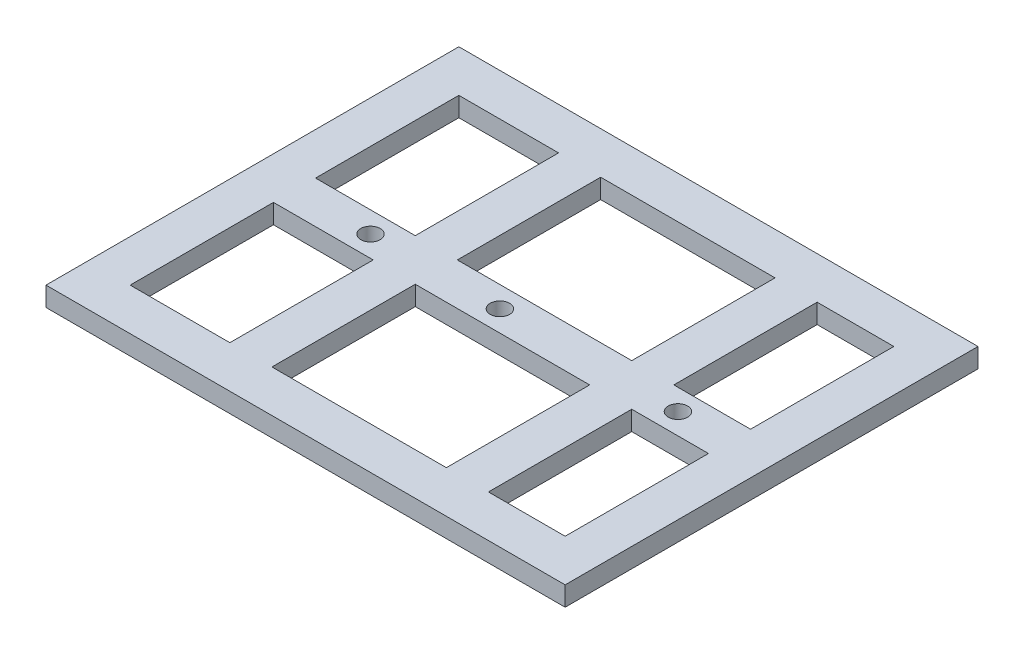
ISO-10303-21;
HEADER;
FILE_DESCRIPTION(('STEP AP214'),'2;1');
FILE_NAME('part.step','',(''),(''),'','','');
FILE_SCHEMA(('AUTOMOTIVE_DESIGN { 1 0 10303 214 1 1 1 1 }'));
ENDSEC;
DATA;
#1=APPLICATION_CONTEXT('core data for automotive mechanical design processes');
#2=APPLICATION_PROTOCOL_DEFINITION('international standard','automotive_design',2000,#1);
#3=PRODUCT_CONTEXT('',#1,'mechanical');
#4=PRODUCT('Part','Part','',(#3));
#5=PRODUCT_RELATED_PRODUCT_CATEGORY('part','',(#4));
#6=PRODUCT_DEFINITION_FORMATION('','',#4);
#7=PRODUCT_DEFINITION_CONTEXT('part definition',#1,'design');
#8=PRODUCT_DEFINITION('design','',#6,#7);
#9=PRODUCT_DEFINITION_SHAPE('','',#8);
#10=(LENGTH_UNIT() NAMED_UNIT(*) SI_UNIT(.MILLI.,.METRE.));
#11=(NAMED_UNIT(*) PLANE_ANGLE_UNIT() SI_UNIT($,.RADIAN.));
#12=(NAMED_UNIT(*) SI_UNIT($,.STERADIAN.) SOLID_ANGLE_UNIT());
#13=UNCERTAINTY_MEASURE_WITH_UNIT(LENGTH_MEASURE(1.E-05),#10,'distance_accuracy_value','');
#14=(GEOMETRIC_REPRESENTATION_CONTEXT(3) GLOBAL_UNCERTAINTY_ASSIGNED_CONTEXT((#13)) GLOBAL_UNIT_ASSIGNED_CONTEXT((#10,
#11,#12)) REPRESENTATION_CONTEXT('',''));
#15=CARTESIAN_POINT('',(0.,0.,0.));
#16=DIRECTION('',(0.,0.,1.));
#17=DIRECTION('',(1.,0.,0.));
#18=AXIS2_PLACEMENT_3D('',#15,#16,#17);
#19=CARTESIAN_POINT('',(0.,1.5,0.));
#20=DIRECTION('',(0.,1.,0.));
#21=DIRECTION('',(0.,0.,1.));
#22=AXIS2_PLACEMENT_3D('',#19,#20,#21);
#23=PLANE('',#22);
#24=CARTESIAN_POINT('',(-1.86403506424479,1.5,0.));
#25=DIRECTION('',(0.,1.,0.));
#26=DIRECTION('',(0.,0.,1.));
#27=AXIS2_PLACEMENT_3D('',#24,#25,#26);
#28=CIRCLE('',#27,1.5);
#29=CARTESIAN_POINT('',(-1.86403506424479,1.5,1.5));
#30=VERTEX_POINT('',#29);
#31=EDGE_CURVE('E614',#30,#30,#28,.T.);
#32=ORIENTED_EDGE('',*,*,#31,.F.);
#33=EDGE_LOOP('',(#32));
#34=FACE_BOUND('',#33,.T.);
#35=DIRECTION('',(0.,0.,-1.));
#36=VECTOR('',#35,1.);
#37=CARTESIAN_POINT('',(15.2481948309043,1.5,3.25));
#38=LINE('',#37,#36);
#39=CARTESIAN_POINT('',(15.2481948309043,1.5,25.3904986670103));
#40=VERTEX_POINT('',#39);
#41=CARTESIAN_POINT('',(15.2481948309043,1.5,3.25));
#42=VERTEX_POINT('',#41);
#43=EDGE_CURVE('E232',#40,#42,#38,.T.);
#44=ORIENTED_EDGE('',*,*,#43,.F.);
#45=DIRECTION('',(1.,0.,0.));
#46=VECTOR('',#45,1.);
#47=CARTESIAN_POINT('',(-11.6956151921089,1.5,25.3904986670103));
#48=LINE('',#47,#46);
#49=CARTESIAN_POINT('',(-11.6956151921089,1.5,25.3904986670103));
#50=VERTEX_POINT('',#49);
#51=EDGE_CURVE('E224',#50,#40,#48,.T.);
#52=ORIENTED_EDGE('',*,*,#51,.F.);
#53=DIRECTION('',(0.,0.,1.));
#54=VECTOR('',#53,1.);
#55=CARTESIAN_POINT('',(-11.6956151921089,1.5,3.25));
#56=LINE('',#55,#54);
#57=CARTESIAN_POINT('',(-11.6956151921089,1.5,3.25));
#58=VERTEX_POINT('',#57);
#59=EDGE_CURVE('E247',#58,#50,#56,.T.);
#60=ORIENTED_EDGE('',*,*,#59,.F.);
#61=DIRECTION('',(-1.,0.,0.));
#62=VECTOR('',#61,1.);
#63=CARTESIAN_POINT('',(-11.6956151921089,1.5,3.25));
#64=LINE('',#63,#62);
#65=EDGE_CURVE('E245',#42,#58,#64,.T.);
#66=ORIENTED_EDGE('',*,*,#65,.F.);
#67=EDGE_LOOP('',(#44,#52,#60,#66));
#68=FACE_BOUND('',#67,.T.);
#69=DIRECTION('',(0.,0.,1.));
#70=VECTOR('',#69,1.);
#71=CARTESIAN_POINT('',(-11.6956151921089,1.5,-25.3904986670103));
#72=LINE('',#71,#70);
#73=CARTESIAN_POINT('',(-11.6956151921089,1.5,-25.3904986670103));
#74=VERTEX_POINT('',#73);
#75=CARTESIAN_POINT('',(-11.6956151921089,1.5,-3.24999999999999));
#76=VERTEX_POINT('',#75);
#77=EDGE_CURVE('E265',#74,#76,#72,.T.);
#78=ORIENTED_EDGE('',*,*,#77,.F.);
#79=DIRECTION('',(-1.,0.,0.));
#80=VECTOR('',#79,1.);
#81=CARTESIAN_POINT('',(-11.6956151921089,1.5,-25.3904986670103));
#82=LINE('',#81,#80);
#83=CARTESIAN_POINT('',(15.2481948309043,1.5,-25.3904986670103));
#84=VERTEX_POINT('',#83);
#85=EDGE_CURVE('E263',#84,#74,#82,.T.);
#86=ORIENTED_EDGE('',*,*,#85,.F.);
#87=DIRECTION('',(0.,0.,-1.));
#88=VECTOR('',#87,1.);
#89=CARTESIAN_POINT('',(15.2481948309043,1.5,-25.3904986670103));
#90=LINE('',#89,#88);
#91=CARTESIAN_POINT('',(15.2481948309043,1.5,-3.24999999999999));
#92=VERTEX_POINT('',#91);
#93=EDGE_CURVE('E271',#92,#84,#90,.T.);
#94=ORIENTED_EDGE('',*,*,#93,.F.);
#95=DIRECTION('',(1.,0.,0.));
#96=VECTOR('',#95,1.);
#97=CARTESIAN_POINT('',(-11.6956151921089,1.5,-3.24999999999999));
#98=LINE('',#97,#96);
#99=EDGE_CURVE('E268',#76,#92,#98,.T.);
#100=ORIENTED_EDGE('',*,*,#99,.F.);
#101=EDGE_LOOP('',(#78,#86,#94,#100));
#102=FACE_BOUND('',#101,.T.);
#103=DIRECTION('',(0.,0.,-1.));
#104=VECTOR('',#103,1.);
#105=CARTESIAN_POINT('',(33.6012807303815,1.5,25.3904986670103));
#106=LINE('',#105,#104);
#107=CARTESIAN_POINT('',(33.6012807303815,1.5,25.3904986670103));
#108=VERTEX_POINT('',#107);
#109=CARTESIAN_POINT('',(33.6012807303815,1.5,3.24999999999999));
#110=VERTEX_POINT('',#109);
#111=EDGE_CURVE('E296',#108,#110,#106,.T.);
#112=ORIENTED_EDGE('',*,*,#111,.F.);
#113=DIRECTION('',(1.,0.,0.));
#114=VECTOR('',#113,1.);
#115=CARTESIAN_POINT('',(21.7481948309043,1.5,25.3904986670103));
#116=LINE('',#115,#114);
#117=CARTESIAN_POINT('',(21.7481948309043,1.5,25.3904986670103));
#118=VERTEX_POINT('',#117);
#119=EDGE_CURVE('E294',#118,#108,#116,.T.);
#120=ORIENTED_EDGE('',*,*,#119,.F.);
#121=DIRECTION('',(0.,0.,1.));
#122=VECTOR('',#121,1.);
#123=CARTESIAN_POINT('',(21.7481948309043,1.5,3.24999999999999));
#124=LINE('',#123,#122);
#125=CARTESIAN_POINT('',(21.7481948309043,1.5,3.24999999999999));
#126=VERTEX_POINT('',#125);
#127=EDGE_CURVE('E302',#126,#118,#124,.T.);
#128=ORIENTED_EDGE('',*,*,#127,.F.);
#129=DIRECTION('',(-1.,0.,0.));
#130=VECTOR('',#129,1.);
#131=CARTESIAN_POINT('',(21.7481948309043,1.5,3.24999999999999));
#132=LINE('',#131,#130);
#133=EDGE_CURVE('E299',#110,#126,#132,.T.);
#134=ORIENTED_EDGE('',*,*,#133,.F.);
#135=EDGE_LOOP('',(#112,#120,#128,#134));
#136=FACE_BOUND('',#135,.T.);
#137=DIRECTION('',(1.,0.,0.));
#138=VECTOR('',#137,1.);
#139=CARTESIAN_POINT('',(-33.6012807303815,1.5,-3.24999999999999));
#140=LINE('',#139,#138);
#141=CARTESIAN_POINT('',(-33.6012807303815,1.5,-3.24999999999999));
#142=VERTEX_POINT('',#141);
#143=CARTESIAN_POINT('',(-18.1956151921089,1.5,-3.24999999999999));
#144=VERTEX_POINT('',#143);
#145=EDGE_CURVE('E327',#142,#144,#140,.T.);
#146=ORIENTED_EDGE('',*,*,#145,.F.);
#147=DIRECTION('',(0.,0.,1.));
#148=VECTOR('',#147,1.);
#149=CARTESIAN_POINT('',(-33.6012807303815,1.5,-3.24999999999999));
#150=LINE('',#149,#148);
#151=CARTESIAN_POINT('',(-33.6012807303815,1.5,-25.3904986670103));
#152=VERTEX_POINT('',#151);
#153=EDGE_CURVE('E325',#152,#142,#150,.T.);
#154=ORIENTED_EDGE('',*,*,#153,.F.);
#155=DIRECTION('',(-1.,0.,0.));
#156=VECTOR('',#155,1.);
#157=CARTESIAN_POINT('',(-33.6012807303815,1.5,-25.3904986670103));
#158=LINE('',#157,#156);
#159=CARTESIAN_POINT('',(-18.1956151921089,1.5,-25.3904986670103));
#160=VERTEX_POINT('',#159);
#161=EDGE_CURVE('E333',#160,#152,#158,.T.);
#162=ORIENTED_EDGE('',*,*,#161,.F.);
#163=DIRECTION('',(0.,0.,-1.));
#164=VECTOR('',#163,1.);
#165=CARTESIAN_POINT('',(-18.1956151921089,1.5,-25.3904986670103));
#166=LINE('',#165,#164);
#167=EDGE_CURVE('E330',#144,#160,#166,.T.);
#168=ORIENTED_EDGE('',*,*,#167,.F.);
#169=EDGE_LOOP('',(#146,#154,#162,#168));
#170=FACE_BOUND('',#169,.T.);
#171=DIRECTION('',(1.,0.,0.));
#172=VECTOR('',#171,1.);
#173=CARTESIAN_POINT('',(-33.6012807303815,1.5,25.3904986670103));
#174=LINE('',#173,#172);
#175=CARTESIAN_POINT('',(-33.6012807303815,1.5,25.3904986670103));
#176=VERTEX_POINT('',#175);
#177=CARTESIAN_POINT('',(-18.1956151921089,1.5,25.3904986670103));
#178=VERTEX_POINT('',#177);
#179=EDGE_CURVE('E358',#176,#178,#174,.T.);
#180=ORIENTED_EDGE('',*,*,#179,.F.);
#181=DIRECTION('',(0.,0.,1.));
#182=VECTOR('',#181,1.);
#183=CARTESIAN_POINT('',(-33.6012807303815,1.5,25.3904986670103));
#184=LINE('',#183,#182);
#185=CARTESIAN_POINT('',(-33.6012807303815,1.5,3.25000000000001));
#186=VERTEX_POINT('',#185);
#187=EDGE_CURVE('E356',#186,#176,#184,.T.);
#188=ORIENTED_EDGE('',*,*,#187,.F.);
#189=DIRECTION('',(-1.,0.,0.));
#190=VECTOR('',#189,1.);
#191=CARTESIAN_POINT('',(-33.6012807303815,1.5,3.25000000000001));
#192=LINE('',#191,#190);
#193=CARTESIAN_POINT('',(-18.1956151921089,1.5,3.25));
#194=VERTEX_POINT('',#193);
#195=EDGE_CURVE('E364',#194,#186,#192,.T.);
#196=ORIENTED_EDGE('',*,*,#195,.F.);
#197=DIRECTION('',(0.,0.,-1.));
#198=VECTOR('',#197,1.);
#199=CARTESIAN_POINT('',(-18.1956151921089,1.5,3.25));
#200=LINE('',#199,#198);
#201=EDGE_CURVE('E361',#178,#194,#200,.T.);
#202=ORIENTED_EDGE('',*,*,#201,.F.);
#203=EDGE_LOOP('',(#180,#188,#196,#202));
#204=FACE_BOUND('',#203,.T.);
#205=DIRECTION('',(-1.,0.,0.));
#206=VECTOR('',#205,1.);
#207=CARTESIAN_POINT('',(21.7481948309042,1.5,-25.3904986670103));
#208=LINE('',#207,#206);
#209=CARTESIAN_POINT('',(33.6012807303815,1.5,-25.3904986670103));
#210=VERTEX_POINT('',#209);
#211=CARTESIAN_POINT('',(21.7481948309042,1.5,-25.3904986670103));
#212=VERTEX_POINT('',#211);
#213=EDGE_CURVE('E389',#210,#212,#208,.T.);
#214=ORIENTED_EDGE('',*,*,#213,.F.);
#215=DIRECTION('',(0.,0.,-1.));
#216=VECTOR('',#215,1.);
#217=CARTESIAN_POINT('',(33.6012807303815,1.5,-3.24999999999999));
#218=LINE('',#217,#216);
#219=CARTESIAN_POINT('',(33.6012807303815,1.5,-3.24999999999999));
#220=VERTEX_POINT('',#219);
#221=EDGE_CURVE('E387',#220,#210,#218,.T.);
#222=ORIENTED_EDGE('',*,*,#221,.F.);
#223=DIRECTION('',(1.,0.,0.));
#224=VECTOR('',#223,1.);
#225=CARTESIAN_POINT('',(21.7481948309043,1.5,-3.24999999999999));
#226=LINE('',#225,#224);
#227=CARTESIAN_POINT('',(21.7481948309043,1.5,-3.24999999999999));
#228=VERTEX_POINT('',#227);
#229=EDGE_CURVE('E395',#228,#220,#226,.T.);
#230=ORIENTED_EDGE('',*,*,#229,.F.);
#231=DIRECTION('',(0.,0.,1.));
#232=VECTOR('',#231,1.);
#233=CARTESIAN_POINT('',(21.7481948309042,1.5,-25.3904986670103));
#234=LINE('',#233,#232);
#235=EDGE_CURVE('E392',#212,#228,#234,.T.);
#236=ORIENTED_EDGE('',*,*,#235,.F.);
#237=EDGE_LOOP('',(#214,#222,#230,#236));
#238=FACE_BOUND('',#237,.T.);
#239=DIRECTION('',(1.,0.,0.));
#240=VECTOR('',#239,1.);
#241=CARTESIAN_POINT('',(-40.1012807303815,1.5,31.8904986670103));
#242=LINE('',#241,#240);
#243=CARTESIAN_POINT('',(-40.1012807303815,1.5,31.8904986670103));
#244=VERTEX_POINT('',#243);
#245=CARTESIAN_POINT('',(40.1012807303815,1.5,31.8904986670103));
#246=VERTEX_POINT('',#245);
#247=EDGE_CURVE('E418',#244,#246,#242,.T.);
#248=ORIENTED_EDGE('',*,*,#247,.T.);
#249=DIRECTION('',(0.,0.,-1.));
#250=VECTOR('',#249,1.);
#251=CARTESIAN_POINT('',(40.1012807303815,1.5,31.8904986670103));
#252=LINE('',#251,#250);
#253=CARTESIAN_POINT('',(40.1012807303815,1.5,-31.8904986670103));
#254=VERTEX_POINT('',#253);
#255=EDGE_CURVE('E421',#246,#254,#252,.T.);
#256=ORIENTED_EDGE('',*,*,#255,.T.);
#257=DIRECTION('',(-1.,0.,0.));
#258=VECTOR('',#257,1.);
#259=CARTESIAN_POINT('',(-40.1012807303815,1.5,-31.8904986670103));
#260=LINE('',#259,#258);
#261=CARTESIAN_POINT('',(-40.1012807303815,1.5,-31.8904986670103));
#262=VERTEX_POINT('',#261);
#263=EDGE_CURVE('E424',#254,#262,#260,.T.);
#264=ORIENTED_EDGE('',*,*,#263,.T.);
#265=DIRECTION('',(0.,0.,1.));
#266=VECTOR('',#265,1.);
#267=CARTESIAN_POINT('',(-40.1012807303815,1.5,31.8904986670103));
#268=LINE('',#267,#266);
#269=EDGE_CURVE('E426',#262,#244,#268,.T.);
#270=ORIENTED_EDGE('',*,*,#269,.T.);
#271=EDGE_LOOP('',(#248,#256,#264,#270));
#272=FACE_BOUND('',#271,.T.);
#273=CARTESIAN_POINT('',(-21.8640350642448,1.5,0.));
#274=DIRECTION('',(0.,1.,0.));
#275=DIRECTION('',(0.,0.,1.));
#276=AXIS2_PLACEMENT_3D('',#273,#274,#275);
#277=CIRCLE('',#276,1.5);
#278=CARTESIAN_POINT('',(-21.8640350642448,1.5,1.50000000000001));
#279=VERTEX_POINT('',#278);
#280=EDGE_CURVE('E253',#279,#279,#277,.T.);
#281=ORIENTED_EDGE('',*,*,#280,.F.);
#282=EDGE_LOOP('',(#281));
#283=FACE_BOUND('',#282,.T.);
#284=CARTESIAN_POINT('',(25.6359649357552,1.5,0.));
#285=DIRECTION('',(0.,1.,0.));
#286=DIRECTION('',(0.,0.,1.));
#287=AXIS2_PLACEMENT_3D('',#284,#285,#286);
#288=CIRCLE('',#287,1.5);
#289=CARTESIAN_POINT('',(25.6359649357552,1.5,1.50000000000001));
#290=VERTEX_POINT('',#289);
#291=EDGE_CURVE('E605',#290,#290,#288,.T.);
#292=ORIENTED_EDGE('',*,*,#291,.F.);
#293=EDGE_LOOP('',(#292));
#294=FACE_BOUND('',#293,.T.);
#295=ADVANCED_FACE('F39',(#34,#68,#102,#136,#170,#204,#238,#272,#283,#294),#23,.T.);
#296=CARTESIAN_POINT('',(0.,-1.5,0.));
#297=DIRECTION('',(0.,1.,0.));
#298=DIRECTION('',(0.,0.,1.));
#299=AXIS2_PLACEMENT_3D('',#296,#297,#298);
#300=PLANE('',#299);
#301=DIRECTION('',(-1.,0.,0.));
#302=VECTOR('',#301,1.);
#303=CARTESIAN_POINT('',(-11.6956151921089,-1.5,-25.3904986670103));
#304=LINE('',#303,#302);
#305=CARTESIAN_POINT('',(15.2481948309043,-1.5,-25.3904986670103));
#306=VERTEX_POINT('',#305);
#307=CARTESIAN_POINT('',(-11.6956151921089,-1.5,-25.3904986670103));
#308=VERTEX_POINT('',#307);
#309=EDGE_CURVE('E240',#306,#308,#304,.T.);
#310=ORIENTED_EDGE('',*,*,#309,.T.);
#311=DIRECTION('',(0.,0.,1.));
#312=VECTOR('',#311,1.);
#313=CARTESIAN_POINT('',(-11.6956151921089,-1.5,-25.3904986670103));
#314=LINE('',#313,#312);
#315=CARTESIAN_POINT('',(-11.6956151921089,-1.5,-3.24999999999999));
#316=VERTEX_POINT('',#315);
#317=EDGE_CURVE('E276',#308,#316,#314,.T.);
#318=ORIENTED_EDGE('',*,*,#317,.T.);
#319=DIRECTION('',(1.,0.,0.));
#320=VECTOR('',#319,1.);
#321=CARTESIAN_POINT('',(-11.6956151921089,-1.5,-3.24999999999999));
#322=LINE('',#321,#320);
#323=CARTESIAN_POINT('',(15.2481948309043,-1.5,-3.24999999999999));
#324=VERTEX_POINT('',#323);
#325=EDGE_CURVE('E279',#316,#324,#322,.T.);
#326=ORIENTED_EDGE('',*,*,#325,.T.);
#327=DIRECTION('',(0.,0.,-1.));
#328=VECTOR('',#327,1.);
#329=CARTESIAN_POINT('',(15.2481948309043,-1.5,-25.3904986670103));
#330=LINE('',#329,#328);
#331=EDGE_CURVE('E266',#324,#306,#330,.T.);
#332=ORIENTED_EDGE('',*,*,#331,.T.);
#333=EDGE_LOOP('',(#310,#318,#326,#332));
#334=FACE_BOUND('',#333,.T.);
#335=DIRECTION('',(0.,0.,1.));
#336=VECTOR('',#335,1.);
#337=CARTESIAN_POINT('',(-33.6012807303815,-1.5,-3.24999999999999));
#338=LINE('',#337,#336);
#339=CARTESIAN_POINT('',(-33.6012807303815,-1.5,-25.3904986670103));
#340=VERTEX_POINT('',#339);
#341=CARTESIAN_POINT('',(-33.6012807303815,-1.5,-3.24999999999999));
#342=VERTEX_POINT('',#341);
#343=EDGE_CURVE('E324',#340,#342,#338,.T.);
#344=ORIENTED_EDGE('',*,*,#343,.T.);
#345=DIRECTION('',(1.,0.,0.));
#346=VECTOR('',#345,1.);
#347=CARTESIAN_POINT('',(-33.6012807303815,-1.5,-3.24999999999999));
#348=LINE('',#347,#346);
#349=CARTESIAN_POINT('',(-18.1956151921089,-1.5,-3.24999999999999));
#350=VERTEX_POINT('',#349);
#351=EDGE_CURVE('E338',#342,#350,#348,.T.);
#352=ORIENTED_EDGE('',*,*,#351,.T.);
#353=DIRECTION('',(0.,0.,-1.));
#354=VECTOR('',#353,1.);
#355=CARTESIAN_POINT('',(-18.1956151921089,-1.5,-25.3904986670103));
#356=LINE('',#355,#354);
#357=CARTESIAN_POINT('',(-18.1956151921089,-1.5,-25.3904986670103));
#358=VERTEX_POINT('',#357);
#359=EDGE_CURVE('E341',#350,#358,#356,.T.);
#360=ORIENTED_EDGE('',*,*,#359,.T.);
#361=DIRECTION('',(-1.,0.,0.));
#362=VECTOR('',#361,1.);
#363=CARTESIAN_POINT('',(-33.6012807303815,-1.5,-25.3904986670103));
#364=LINE('',#363,#362);
#365=EDGE_CURVE('E328',#358,#340,#364,.T.);
#366=ORIENTED_EDGE('',*,*,#365,.T.);
#367=EDGE_LOOP('',(#344,#352,#360,#366));
#368=FACE_BOUND('',#367,.T.);
#369=DIRECTION('',(0.,0.,-1.));
#370=VECTOR('',#369,1.);
#371=CARTESIAN_POINT('',(33.6012807303815,-1.5,-3.24999999999999));
#372=LINE('',#371,#370);
#373=CARTESIAN_POINT('',(33.6012807303815,-1.5,-3.24999999999999));
#374=VERTEX_POINT('',#373);
#375=CARTESIAN_POINT('',(33.6012807303815,-1.5,-25.3904986670103));
#376=VERTEX_POINT('',#375);
#377=EDGE_CURVE('E386',#374,#376,#372,.T.);
#378=ORIENTED_EDGE('',*,*,#377,.T.);
#379=DIRECTION('',(-1.,0.,0.));
#380=VECTOR('',#379,1.);
#381=CARTESIAN_POINT('',(21.7481948309042,-1.5,-25.3904986670103));
#382=LINE('',#381,#380);
#383=CARTESIAN_POINT('',(21.7481948309042,-1.5,-25.3904986670103));
#384=VERTEX_POINT('',#383);
#385=EDGE_CURVE('E400',#376,#384,#382,.T.);
#386=ORIENTED_EDGE('',*,*,#385,.T.);
#387=DIRECTION('',(0.,0.,1.));
#388=VECTOR('',#387,1.);
#389=CARTESIAN_POINT('',(21.7481948309042,-1.5,-25.3904986670103));
#390=LINE('',#389,#388);
#391=CARTESIAN_POINT('',(21.7481948309043,-1.5,-3.24999999999999));
#392=VERTEX_POINT('',#391);
#393=EDGE_CURVE('E403',#384,#392,#390,.T.);
#394=ORIENTED_EDGE('',*,*,#393,.T.);
#395=DIRECTION('',(1.,0.,0.));
#396=VECTOR('',#395,1.);
#397=CARTESIAN_POINT('',(21.7481948309043,-1.5,-3.24999999999999));
#398=LINE('',#397,#396);
#399=EDGE_CURVE('E390',#392,#374,#398,.T.);
#400=ORIENTED_EDGE('',*,*,#399,.T.);
#401=EDGE_LOOP('',(#378,#386,#394,#400));
#402=FACE_BOUND('',#401,.T.);
#403=DIRECTION('',(1.,0.,0.));
#404=VECTOR('',#403,1.);
#405=CARTESIAN_POINT('',(-40.1012807303815,-1.5,31.8904986670103));
#406=LINE('',#405,#404);
#407=CARTESIAN_POINT('',(-40.1012807303815,-1.5,31.8904986670103));
#408=VERTEX_POINT('',#407);
#409=CARTESIAN_POINT('',(40.1012807303815,-1.5,31.8904986670103));
#410=VERTEX_POINT('',#409);
#411=EDGE_CURVE('E417',#408,#410,#406,.T.);
#412=ORIENTED_EDGE('',*,*,#411,.F.);
#413=DIRECTION('',(0.,0.,1.));
#414=VECTOR('',#413,1.);
#415=CARTESIAN_POINT('',(-40.1012807303815,-1.5,31.8904986670103));
#416=LINE('',#415,#414);
#417=CARTESIAN_POINT('',(-40.1012807303815,-1.5,-31.8904986670103));
#418=VERTEX_POINT('',#417);
#419=EDGE_CURVE('E422',#418,#408,#416,.T.);
#420=ORIENTED_EDGE('',*,*,#419,.F.);
#421=DIRECTION('',(-1.,0.,0.));
#422=VECTOR('',#421,1.);
#423=CARTESIAN_POINT('',(-40.1012807303815,-1.5,-31.8904986670103));
#424=LINE('',#423,#422);
#425=CARTESIAN_POINT('',(40.1012807303815,-1.5,-31.8904986670103));
#426=VERTEX_POINT('',#425);
#427=EDGE_CURVE('E433',#426,#418,#424,.T.);
#428=ORIENTED_EDGE('',*,*,#427,.F.);
#429=DIRECTION('',(0.,0.,-1.));
#430=VECTOR('',#429,1.);
#431=CARTESIAN_POINT('',(40.1012807303815,-1.5,31.8904986670103));
#432=LINE('',#431,#430);
#433=EDGE_CURVE('E431',#410,#426,#432,.T.);
#434=ORIENTED_EDGE('',*,*,#433,.F.);
#435=EDGE_LOOP('',(#412,#420,#428,#434));
#436=FACE_BOUND('',#435,.T.);
#437=DIRECTION('',(0.,0.,1.));
#438=VECTOR('',#437,1.);
#439=CARTESIAN_POINT('',(-33.6012807303815,-1.5,25.3904986670103));
#440=LINE('',#439,#438);
#441=CARTESIAN_POINT('',(-33.6012807303815,-1.5,3.25000000000001));
#442=VERTEX_POINT('',#441);
#443=CARTESIAN_POINT('',(-33.6012807303815,-1.5,25.3904986670103));
#444=VERTEX_POINT('',#443);
#445=EDGE_CURVE('E355',#442,#444,#440,.T.);
#446=ORIENTED_EDGE('',*,*,#445,.T.);
#447=DIRECTION('',(1.,0.,0.));
#448=VECTOR('',#447,1.);
#449=CARTESIAN_POINT('',(-33.6012807303815,-1.5,25.3904986670103));
#450=LINE('',#449,#448);
#451=CARTESIAN_POINT('',(-18.1956151921089,-1.5,25.3904986670103));
#452=VERTEX_POINT('',#451);
#453=EDGE_CURVE('E369',#444,#452,#450,.T.);
#454=ORIENTED_EDGE('',*,*,#453,.T.);
#455=DIRECTION('',(0.,0.,-1.));
#456=VECTOR('',#455,1.);
#457=CARTESIAN_POINT('',(-18.1956151921089,-1.5,3.25));
#458=LINE('',#457,#456);
#459=CARTESIAN_POINT('',(-18.1956151921089,-1.5,3.25));
#460=VERTEX_POINT('',#459);
#461=EDGE_CURVE('E372',#452,#460,#458,.T.);
#462=ORIENTED_EDGE('',*,*,#461,.T.);
#463=DIRECTION('',(-1.,0.,0.));
#464=VECTOR('',#463,1.);
#465=CARTESIAN_POINT('',(-33.6012807303815,-1.5,3.25000000000001));
#466=LINE('',#465,#464);
#467=EDGE_CURVE('E359',#460,#442,#466,.T.);
#468=ORIENTED_EDGE('',*,*,#467,.T.);
#469=EDGE_LOOP('',(#446,#454,#462,#468));
#470=FACE_BOUND('',#469,.T.);
#471=DIRECTION('',(1.,0.,0.));
#472=VECTOR('',#471,1.);
#473=CARTESIAN_POINT('',(21.7481948309043,-1.5,25.3904986670103));
#474=LINE('',#473,#472);
#475=CARTESIAN_POINT('',(21.7481948309043,-1.5,25.3904986670103));
#476=VERTEX_POINT('',#475);
#477=CARTESIAN_POINT('',(33.6012807303815,-1.5,25.3904986670103));
#478=VERTEX_POINT('',#477);
#479=EDGE_CURVE('E293',#476,#478,#474,.T.);
#480=ORIENTED_EDGE('',*,*,#479,.T.);
#481=DIRECTION('',(0.,0.,-1.));
#482=VECTOR('',#481,1.);
#483=CARTESIAN_POINT('',(33.6012807303815,-1.5,25.3904986670103));
#484=LINE('',#483,#482);
#485=CARTESIAN_POINT('',(33.6012807303815,-1.5,3.24999999999999));
#486=VERTEX_POINT('',#485);
#487=EDGE_CURVE('E307',#478,#486,#484,.T.);
#488=ORIENTED_EDGE('',*,*,#487,.T.);
#489=DIRECTION('',(-1.,0.,0.));
#490=VECTOR('',#489,1.);
#491=CARTESIAN_POINT('',(21.7481948309043,-1.5,3.24999999999999));
#492=LINE('',#491,#490);
#493=CARTESIAN_POINT('',(21.7481948309043,-1.5,3.24999999999999));
#494=VERTEX_POINT('',#493);
#495=EDGE_CURVE('E310',#486,#494,#492,.T.);
#496=ORIENTED_EDGE('',*,*,#495,.T.);
#497=DIRECTION('',(0.,0.,1.));
#498=VECTOR('',#497,1.);
#499=CARTESIAN_POINT('',(21.7481948309043,-1.5,3.24999999999999));
#500=LINE('',#499,#498);
#501=EDGE_CURVE('E297',#494,#476,#500,.T.);
#502=ORIENTED_EDGE('',*,*,#501,.T.);
#503=EDGE_LOOP('',(#480,#488,#496,#502));
#504=FACE_BOUND('',#503,.T.);
#505=DIRECTION('',(1.,0.,0.));
#506=VECTOR('',#505,1.);
#507=CARTESIAN_POINT('',(-11.6956151921089,-1.5,25.3904986670103));
#508=LINE('',#507,#506);
#509=CARTESIAN_POINT('',(-11.6956151921089,-1.5,25.3904986670103));
#510=VERTEX_POINT('',#509);
#511=CARTESIAN_POINT('',(15.2481948309043,-1.5,25.3904986670103));
#512=VERTEX_POINT('',#511);
#513=EDGE_CURVE('E62',#510,#512,#508,.T.);
#514=ORIENTED_EDGE('',*,*,#513,.T.);
#515=DIRECTION('',(0.,0.,-1.));
#516=VECTOR('',#515,1.);
#517=CARTESIAN_POINT('',(15.2481948309043,-1.5,3.25));
#518=LINE('',#517,#516);
#519=CARTESIAN_POINT('',(15.2481948309043,-1.5,3.25));
#520=VERTEX_POINT('',#519);
#521=EDGE_CURVE('E239',#512,#520,#518,.T.);
#522=ORIENTED_EDGE('',*,*,#521,.T.);
#523=DIRECTION('',(-1.,0.,0.));
#524=VECTOR('',#523,1.);
#525=CARTESIAN_POINT('',(-11.6956151921089,-1.5,3.25));
#526=LINE('',#525,#524);
#527=CARTESIAN_POINT('',(-11.6956151921089,-1.5,3.25));
#528=VERTEX_POINT('',#527);
#529=EDGE_CURVE('E255',#520,#528,#526,.T.);
#530=ORIENTED_EDGE('',*,*,#529,.T.);
#531=DIRECTION('',(0.,0.,1.));
#532=VECTOR('',#531,1.);
#533=CARTESIAN_POINT('',(-11.6956151921089,-1.5,3.25));
#534=LINE('',#533,#532);
#535=EDGE_CURVE('E233',#528,#510,#534,.T.);
#536=ORIENTED_EDGE('',*,*,#535,.T.);
#537=EDGE_LOOP('',(#514,#522,#530,#536));
#538=FACE_BOUND('',#537,.T.);
#539=CARTESIAN_POINT('',(-21.8640350642448,-1.5,0.));
#540=DIRECTION('',(0.,1.,0.));
#541=DIRECTION('',(0.,0.,1.));
#542=AXIS2_PLACEMENT_3D('',#539,#540,#541);
#543=CIRCLE('',#542,1.5);
#544=CARTESIAN_POINT('',(-21.8640350642448,-1.5,1.50000000000001));
#545=VERTEX_POINT('',#544);
#546=EDGE_CURVE('E617',#545,#545,#543,.T.);
#547=ORIENTED_EDGE('',*,*,#546,.T.);
#548=EDGE_LOOP('',(#547));
#549=FACE_BOUND('',#548,.T.);
#550=CARTESIAN_POINT('',(-1.86403506424479,-1.5,0.));
#551=DIRECTION('',(0.,1.,0.));
#552=DIRECTION('',(0.,0.,1.));
#553=AXIS2_PLACEMENT_3D('',#550,#551,#552);
#554=CIRCLE('',#553,1.5);
#555=CARTESIAN_POINT('',(-1.86403506424479,-1.5,1.5));
#556=VERTEX_POINT('',#555);
#557=EDGE_CURVE('E611',#556,#556,#554,.T.);
#558=ORIENTED_EDGE('',*,*,#557,.T.);
#559=EDGE_LOOP('',(#558));
#560=FACE_BOUND('',#559,.T.);
#561=CARTESIAN_POINT('',(25.6359649357552,-1.5,0.));
#562=DIRECTION('',(0.,1.,0.));
#563=DIRECTION('',(0.,0.,1.));
#564=AXIS2_PLACEMENT_3D('',#561,#562,#563);
#565=CIRCLE('',#564,1.5);
#566=CARTESIAN_POINT('',(25.6359649357552,-1.5,1.50000000000001));
#567=VERTEX_POINT('',#566);
#568=EDGE_CURVE('E608',#567,#567,#565,.T.);
#569=ORIENTED_EDGE('',*,*,#568,.T.);
#570=EDGE_LOOP('',(#569));
#571=FACE_BOUND('',#570,.T.);
#572=ADVANCED_FACE('F451',(#334,#368,#402,#436,#470,#504,#538,#549,#560,#571),#300,.F.);
#573=CARTESIAN_POINT('',(-40.1012807303815,1.5,31.8904986670103));
#574=DIRECTION('',(0.,0.,-1.));
#575=DIRECTION('',(-1.,0.,0.));
#576=AXIS2_PLACEMENT_3D('',#573,#574,#575);
#577=PLANE('',#576);
#578=ORIENTED_EDGE('',*,*,#411,.T.);
#579=DIRECTION('',(0.,-1.,0.));
#580=VECTOR('',#579,1.);
#581=CARTESIAN_POINT('',(40.1012807303815,1.5,31.8904986670103));
#582=LINE('',#581,#580);
#583=EDGE_CURVE('E11',#246,#410,#582,.T.);
#584=ORIENTED_EDGE('',*,*,#583,.F.);
#585=ORIENTED_EDGE('',*,*,#247,.F.);
#586=DIRECTION('',(0.,-1.,0.));
#587=VECTOR('',#586,1.);
#588=CARTESIAN_POINT('',(-40.1012807303815,1.5,31.8904986670103));
#589=LINE('',#588,#587);
#590=EDGE_CURVE('E428',#244,#408,#589,.T.);
#591=ORIENTED_EDGE('',*,*,#590,.T.);
#592=EDGE_LOOP('',(#578,#584,#585,#591));
#593=FACE_BOUND('',#592,.T.);
#594=ADVANCED_FACE('F41',(#593),#577,.F.);
#595=CARTESIAN_POINT('',(40.1012807303815,1.5,31.8904986670103));
#596=DIRECTION('',(-1.,0.,0.));
#597=DIRECTION('',(0.,0.,1.));
#598=AXIS2_PLACEMENT_3D('',#595,#596,#597);
#599=PLANE('',#598);
#600=ORIENTED_EDGE('',*,*,#433,.T.);
#601=DIRECTION('',(0.,-1.,0.));
#602=VECTOR('',#601,1.);
#603=CARTESIAN_POINT('',(40.1012807303815,1.5,-31.8904986670103));
#604=LINE('',#603,#602);
#605=EDGE_CURVE('E47',#254,#426,#604,.T.);
#606=ORIENTED_EDGE('',*,*,#605,.F.);
#607=ORIENTED_EDGE('',*,*,#255,.F.);
#608=ORIENTED_EDGE('',*,*,#583,.T.);
#609=EDGE_LOOP('',(#600,#606,#607,#608));
#610=FACE_BOUND('',#609,.T.);
#611=ADVANCED_FACE('F462',(#610),#599,.F.);
#612=CARTESIAN_POINT('',(-40.1012807303815,1.5,-31.8904986670103));
#613=DIRECTION('',(0.,0.,1.));
#614=DIRECTION('',(1.,0.,0.));
#615=AXIS2_PLACEMENT_3D('',#612,#613,#614);
#616=PLANE('',#615);
#617=ORIENTED_EDGE('',*,*,#427,.T.);
#618=DIRECTION('',(0.,-1.,0.));
#619=VECTOR('',#618,1.);
#620=CARTESIAN_POINT('',(-40.1012807303815,1.5,-31.8904986670103));
#621=LINE('',#620,#619);
#622=EDGE_CURVE('E438',#262,#418,#621,.T.);
#623=ORIENTED_EDGE('',*,*,#622,.F.);
#624=ORIENTED_EDGE('',*,*,#263,.F.);
#625=ORIENTED_EDGE('',*,*,#605,.T.);
#626=EDGE_LOOP('',(#617,#623,#624,#625));
#627=FACE_BOUND('',#626,.T.);
#628=ADVANCED_FACE('F445',(#627),#616,.F.);
#629=CARTESIAN_POINT('',(-40.1012807303815,1.5,31.8904986670103));
#630=DIRECTION('',(1.,0.,0.));
#631=DIRECTION('',(0.,0.,-1.));
#632=AXIS2_PLACEMENT_3D('',#629,#630,#631);
#633=PLANE('',#632);
#634=ORIENTED_EDGE('',*,*,#419,.T.);
#635=ORIENTED_EDGE('',*,*,#590,.F.);
#636=ORIENTED_EDGE('',*,*,#269,.F.);
#637=ORIENTED_EDGE('',*,*,#622,.T.);
#638=EDGE_LOOP('',(#634,#635,#636,#637));
#639=FACE_BOUND('',#638,.T.);
#640=ADVANCED_FACE('F455',(#639),#633,.F.);
#641=CARTESIAN_POINT('',(33.6012807303815,1.5,-3.24999999999999));
#642=DIRECTION('',(-1.,0.,0.));
#643=DIRECTION('',(0.,0.,1.));
#644=AXIS2_PLACEMENT_3D('',#641,#642,#643);
#645=PLANE('',#644);
#646=ORIENTED_EDGE('',*,*,#377,.F.);
#647=DIRECTION('',(0.,-1.,0.));
#648=VECTOR('',#647,1.);
#649=CARTESIAN_POINT('',(33.6012807303815,1.5,-3.24999999999999));
#650=LINE('',#649,#648);
#651=EDGE_CURVE('E397',#220,#374,#650,.T.);
#652=ORIENTED_EDGE('',*,*,#651,.F.);
#653=ORIENTED_EDGE('',*,*,#221,.T.);
#654=DIRECTION('',(0.,-1.,0.));
#655=VECTOR('',#654,1.);
#656=CARTESIAN_POINT('',(33.6012807303815,1.5,-25.3904986670103));
#657=LINE('',#656,#655);
#658=EDGE_CURVE('E414',#210,#376,#657,.T.);
#659=ORIENTED_EDGE('',*,*,#658,.T.);
#660=EDGE_LOOP('',(#646,#652,#653,#659));
#661=FACE_BOUND('',#660,.T.);
#662=ADVANCED_FACE('F479',(#661),#645,.T.);
#663=CARTESIAN_POINT('',(21.7481948309042,1.5,-25.3904986670103));
#664=DIRECTION('',(0.,0.,1.));
#665=DIRECTION('',(1.,0.,0.));
#666=AXIS2_PLACEMENT_3D('',#663,#664,#665);
#667=PLANE('',#666);
#668=ORIENTED_EDGE('',*,*,#385,.F.);
#669=ORIENTED_EDGE('',*,*,#658,.F.);
#670=ORIENTED_EDGE('',*,*,#213,.T.);
#671=DIRECTION('',(0.,-1.,0.));
#672=VECTOR('',#671,1.);
#673=CARTESIAN_POINT('',(21.7481948309042,1.5,-25.3904986670103));
#674=LINE('',#673,#672);
#675=EDGE_CURVE('E412',#212,#384,#674,.T.);
#676=ORIENTED_EDGE('',*,*,#675,.T.);
#677=EDGE_LOOP('',(#668,#669,#670,#676));
#678=FACE_BOUND('',#677,.T.);
#679=ADVANCED_FACE('F486',(#678),#667,.T.);
#680=CARTESIAN_POINT('',(21.7481948309042,1.5,-25.3904986670103));
#681=DIRECTION('',(1.,0.,0.));
#682=DIRECTION('',(0.,0.,-1.));
#683=AXIS2_PLACEMENT_3D('',#680,#681,#682);
#684=PLANE('',#683);
#685=ORIENTED_EDGE('',*,*,#393,.F.);
#686=ORIENTED_EDGE('',*,*,#675,.F.);
#687=ORIENTED_EDGE('',*,*,#235,.T.);
#688=DIRECTION('',(0.,-1.,0.));
#689=VECTOR('',#688,1.);
#690=CARTESIAN_POINT('',(21.7481948309043,1.5,-3.24999999999999));
#691=LINE('',#690,#689);
#692=EDGE_CURVE('E410',#228,#392,#691,.T.);
#693=ORIENTED_EDGE('',*,*,#692,.T.);
#694=EDGE_LOOP('',(#685,#686,#687,#693));
#695=FACE_BOUND('',#694,.T.);
#696=ADVANCED_FACE('F491',(#695),#684,.T.);
#697=CARTESIAN_POINT('',(21.7481948309043,1.5,-3.24999999999999));
#698=DIRECTION('',(0.,0.,-1.));
#699=DIRECTION('',(-1.,0.,0.));
#700=AXIS2_PLACEMENT_3D('',#697,#698,#699);
#701=PLANE('',#700);
#702=ORIENTED_EDGE('',*,*,#399,.F.);
#703=ORIENTED_EDGE('',*,*,#692,.F.);
#704=ORIENTED_EDGE('',*,*,#229,.T.);
#705=ORIENTED_EDGE('',*,*,#651,.T.);
#706=EDGE_LOOP('',(#702,#703,#704,#705));
#707=FACE_BOUND('',#706,.T.);
#708=ADVANCED_FACE('F499',(#707),#701,.T.);
#709=CARTESIAN_POINT('',(-33.6012807303815,1.5,25.3904986670103));
#710=DIRECTION('',(1.,0.,0.));
#711=DIRECTION('',(0.,0.,-1.));
#712=AXIS2_PLACEMENT_3D('',#709,#710,#711);
#713=PLANE('',#712);
#714=ORIENTED_EDGE('',*,*,#445,.F.);
#715=DIRECTION('',(0.,-1.,0.));
#716=VECTOR('',#715,1.);
#717=CARTESIAN_POINT('',(-33.6012807303815,1.5,3.25000000000001));
#718=LINE('',#717,#716);
#719=EDGE_CURVE('E366',#186,#442,#718,.T.);
#720=ORIENTED_EDGE('',*,*,#719,.F.);
#721=ORIENTED_EDGE('',*,*,#187,.T.);
#722=DIRECTION('',(0.,-1.,0.));
#723=VECTOR('',#722,1.);
#724=CARTESIAN_POINT('',(-33.6012807303815,1.5,25.3904986670103));
#725=LINE('',#724,#723);
#726=EDGE_CURVE('E383',#176,#444,#725,.T.);
#727=ORIENTED_EDGE('',*,*,#726,.T.);
#728=EDGE_LOOP('',(#714,#720,#721,#727));
#729=FACE_BOUND('',#728,.T.);
#730=ADVANCED_FACE('F512',(#729),#713,.T.);
#731=CARTESIAN_POINT('',(-33.6012807303815,1.5,25.3904986670103));
#732=DIRECTION('',(0.,0.,-1.));
#733=DIRECTION('',(-1.,0.,0.));
#734=AXIS2_PLACEMENT_3D('',#731,#732,#733);
#735=PLANE('',#734);
#736=ORIENTED_EDGE('',*,*,#453,.F.);
#737=ORIENTED_EDGE('',*,*,#726,.F.);
#738=ORIENTED_EDGE('',*,*,#179,.T.);
#739=DIRECTION('',(0.,-1.,0.));
#740=VECTOR('',#739,1.);
#741=CARTESIAN_POINT('',(-18.1956151921089,1.5,25.3904986670103));
#742=LINE('',#741,#740);
#743=EDGE_CURVE('E381',#178,#452,#742,.T.);
#744=ORIENTED_EDGE('',*,*,#743,.T.);
#745=EDGE_LOOP('',(#736,#737,#738,#744));
#746=FACE_BOUND('',#745,.T.);
#747=ADVANCED_FACE('F517',(#746),#735,.T.);
#748=CARTESIAN_POINT('',(-18.1956151921089,1.5,3.25));
#749=DIRECTION('',(-1.,0.,0.));
#750=DIRECTION('',(0.,0.,1.));
#751=AXIS2_PLACEMENT_3D('',#748,#749,#750);
#752=PLANE('',#751);
#753=ORIENTED_EDGE('',*,*,#461,.F.);
#754=ORIENTED_EDGE('',*,*,#743,.F.);
#755=ORIENTED_EDGE('',*,*,#201,.T.);
#756=DIRECTION('',(0.,-1.,0.));
#757=VECTOR('',#756,1.);
#758=CARTESIAN_POINT('',(-18.1956151921089,1.5,3.25));
#759=LINE('',#758,#757);
#760=EDGE_CURVE('E379',#194,#460,#759,.T.);
#761=ORIENTED_EDGE('',*,*,#760,.T.);
#762=EDGE_LOOP('',(#753,#754,#755,#761));
#763=FACE_BOUND('',#762,.T.);
#764=ADVANCED_FACE('F521',(#763),#752,.T.);
#765=CARTESIAN_POINT('',(-33.6012807303815,1.5,3.25000000000001));
#766=DIRECTION('',(0.,0.,1.));
#767=DIRECTION('',(1.,0.,0.));
#768=AXIS2_PLACEMENT_3D('',#765,#766,#767);
#769=PLANE('',#768);
#770=ORIENTED_EDGE('',*,*,#467,.F.);
#771=ORIENTED_EDGE('',*,*,#760,.F.);
#772=ORIENTED_EDGE('',*,*,#195,.T.);
#773=ORIENTED_EDGE('',*,*,#719,.T.);
#774=EDGE_LOOP('',(#770,#771,#772,#773));
#775=FACE_BOUND('',#774,.T.);
#776=ADVANCED_FACE('F525',(#775),#769,.T.);
#777=CARTESIAN_POINT('',(-33.6012807303815,1.5,-3.24999999999999));
#778=DIRECTION('',(1.,0.,0.));
#779=DIRECTION('',(0.,0.,-1.));
#780=AXIS2_PLACEMENT_3D('',#777,#778,#779);
#781=PLANE('',#780);
#782=ORIENTED_EDGE('',*,*,#343,.F.);
#783=DIRECTION('',(0.,-1.,0.));
#784=VECTOR('',#783,1.);
#785=CARTESIAN_POINT('',(-33.6012807303815,1.5,-25.3904986670103));
#786=LINE('',#785,#784);
#787=EDGE_CURVE('E335',#152,#340,#786,.T.);
#788=ORIENTED_EDGE('',*,*,#787,.F.);
#789=ORIENTED_EDGE('',*,*,#153,.T.);
#790=DIRECTION('',(0.,-1.,0.));
#791=VECTOR('',#790,1.);
#792=CARTESIAN_POINT('',(-33.6012807303815,1.5,-3.24999999999999));
#793=LINE('',#792,#791);
#794=EDGE_CURVE('E352',#142,#342,#793,.T.);
#795=ORIENTED_EDGE('',*,*,#794,.T.);
#796=EDGE_LOOP('',(#782,#788,#789,#795));
#797=FACE_BOUND('',#796,.T.);
#798=ADVANCED_FACE('F529',(#797),#781,.T.);
#799=CARTESIAN_POINT('',(-33.6012807303815,1.5,-3.24999999999999));
#800=DIRECTION('',(0.,0.,-1.));
#801=DIRECTION('',(-1.,0.,0.));
#802=AXIS2_PLACEMENT_3D('',#799,#800,#801);
#803=PLANE('',#802);
#804=ORIENTED_EDGE('',*,*,#351,.F.);
#805=ORIENTED_EDGE('',*,*,#794,.F.);
#806=ORIENTED_EDGE('',*,*,#145,.T.);
#807=DIRECTION('',(0.,-1.,0.));
#808=VECTOR('',#807,1.);
#809=CARTESIAN_POINT('',(-18.1956151921089,1.5,-3.24999999999999));
#810=LINE('',#809,#808);
#811=EDGE_CURVE('E350',#144,#350,#810,.T.);
#812=ORIENTED_EDGE('',*,*,#811,.T.);
#813=EDGE_LOOP('',(#804,#805,#806,#812));
#814=FACE_BOUND('',#813,.T.);
#815=ADVANCED_FACE('F533',(#814),#803,.T.);
#816=CARTESIAN_POINT('',(-18.1956151921089,1.5,-25.3904986670103));
#817=DIRECTION('',(-1.,0.,0.));
#818=DIRECTION('',(0.,0.,1.));
#819=AXIS2_PLACEMENT_3D('',#816,#817,#818);
#820=PLANE('',#819);
#821=ORIENTED_EDGE('',*,*,#359,.F.);
#822=ORIENTED_EDGE('',*,*,#811,.F.);
#823=ORIENTED_EDGE('',*,*,#167,.T.);
#824=DIRECTION('',(0.,-1.,0.));
#825=VECTOR('',#824,1.);
#826=CARTESIAN_POINT('',(-18.1956151921089,1.5,-25.3904986670103));
#827=LINE('',#826,#825);
#828=EDGE_CURVE('E348',#160,#358,#827,.T.);
#829=ORIENTED_EDGE('',*,*,#828,.T.);
#830=EDGE_LOOP('',(#821,#822,#823,#829));
#831=FACE_BOUND('',#830,.T.);
#832=ADVANCED_FACE('F537',(#831),#820,.T.);
#833=CARTESIAN_POINT('',(-33.6012807303815,1.5,-25.3904986670103));
#834=DIRECTION('',(0.,0.,1.));
#835=DIRECTION('',(1.,0.,0.));
#836=AXIS2_PLACEMENT_3D('',#833,#834,#835);
#837=PLANE('',#836);
#838=ORIENTED_EDGE('',*,*,#365,.F.);
#839=ORIENTED_EDGE('',*,*,#828,.F.);
#840=ORIENTED_EDGE('',*,*,#161,.T.);
#841=ORIENTED_EDGE('',*,*,#787,.T.);
#842=EDGE_LOOP('',(#838,#839,#840,#841));
#843=FACE_BOUND('',#842,.T.);
#844=ADVANCED_FACE('F541',(#843),#837,.T.);
#845=CARTESIAN_POINT('',(21.7481948309043,1.5,25.3904986670103));
#846=DIRECTION('',(0.,0.,-1.));
#847=DIRECTION('',(-1.,0.,0.));
#848=AXIS2_PLACEMENT_3D('',#845,#846,#847);
#849=PLANE('',#848);
#850=ORIENTED_EDGE('',*,*,#479,.F.);
#851=DIRECTION('',(0.,-1.,0.));
#852=VECTOR('',#851,1.);
#853=CARTESIAN_POINT('',(21.7481948309043,1.5,25.3904986670103));
#854=LINE('',#853,#852);
#855=EDGE_CURVE('E304',#118,#476,#854,.T.);
#856=ORIENTED_EDGE('',*,*,#855,.F.);
#857=ORIENTED_EDGE('',*,*,#119,.T.);
#858=DIRECTION('',(0.,-1.,0.));
#859=VECTOR('',#858,1.);
#860=CARTESIAN_POINT('',(33.6012807303815,1.5,25.3904986670103));
#861=LINE('',#860,#859);
#862=EDGE_CURVE('E321',#108,#478,#861,.T.);
#863=ORIENTED_EDGE('',*,*,#862,.T.);
#864=EDGE_LOOP('',(#850,#856,#857,#863));
#865=FACE_BOUND('',#864,.T.);
#866=ADVANCED_FACE('F545',(#865),#849,.T.);
#867=CARTESIAN_POINT('',(33.6012807303815,1.5,25.3904986670103));
#868=DIRECTION('',(-1.,0.,0.));
#869=DIRECTION('',(0.,0.,1.));
#870=AXIS2_PLACEMENT_3D('',#867,#868,#869);
#871=PLANE('',#870);
#872=ORIENTED_EDGE('',*,*,#487,.F.);
#873=ORIENTED_EDGE('',*,*,#862,.F.);
#874=ORIENTED_EDGE('',*,*,#111,.T.);
#875=DIRECTION('',(0.,-1.,0.));
#876=VECTOR('',#875,1.);
#877=CARTESIAN_POINT('',(33.6012807303815,1.5,3.24999999999999));
#878=LINE('',#877,#876);
#879=EDGE_CURVE('E319',#110,#486,#878,.T.);
#880=ORIENTED_EDGE('',*,*,#879,.T.);
#881=EDGE_LOOP('',(#872,#873,#874,#880));
#882=FACE_BOUND('',#881,.T.);
#883=ADVANCED_FACE('F549',(#882),#871,.T.);
#884=CARTESIAN_POINT('',(21.7481948309043,1.5,3.24999999999999));
#885=DIRECTION('',(0.,0.,1.));
#886=DIRECTION('',(1.,0.,0.));
#887=AXIS2_PLACEMENT_3D('',#884,#885,#886);
#888=PLANE('',#887);
#889=ORIENTED_EDGE('',*,*,#495,.F.);
#890=ORIENTED_EDGE('',*,*,#879,.F.);
#891=ORIENTED_EDGE('',*,*,#133,.T.);
#892=DIRECTION('',(0.,-1.,0.));
#893=VECTOR('',#892,1.);
#894=CARTESIAN_POINT('',(21.7481948309043,1.5,3.24999999999999));
#895=LINE('',#894,#893);
#896=EDGE_CURVE('E317',#126,#494,#895,.T.);
#897=ORIENTED_EDGE('',*,*,#896,.T.);
#898=EDGE_LOOP('',(#889,#890,#891,#897));
#899=FACE_BOUND('',#898,.T.);
#900=ADVANCED_FACE('F553',(#899),#888,.T.);
#901=CARTESIAN_POINT('',(21.7481948309043,1.5,3.24999999999999));
#902=DIRECTION('',(1.,0.,0.));
#903=DIRECTION('',(0.,0.,-1.));
#904=AXIS2_PLACEMENT_3D('',#901,#902,#903);
#905=PLANE('',#904);
#906=ORIENTED_EDGE('',*,*,#501,.F.);
#907=ORIENTED_EDGE('',*,*,#896,.F.);
#908=ORIENTED_EDGE('',*,*,#127,.T.);
#909=ORIENTED_EDGE('',*,*,#855,.T.);
#910=EDGE_LOOP('',(#906,#907,#908,#909));
#911=FACE_BOUND('',#910,.T.);
#912=ADVANCED_FACE('F557',(#911),#905,.T.);
#913=CARTESIAN_POINT('',(-11.6956151921089,1.5,-25.3904986670103));
#914=DIRECTION('',(0.,0.,1.));
#915=DIRECTION('',(1.,0.,0.));
#916=AXIS2_PLACEMENT_3D('',#913,#914,#915);
#917=PLANE('',#916);
#918=ORIENTED_EDGE('',*,*,#309,.F.);
#919=DIRECTION('',(0.,-1.,0.));
#920=VECTOR('',#919,1.);
#921=CARTESIAN_POINT('',(15.2481948309043,1.5,-25.3904986670103));
#922=LINE('',#921,#920);
#923=EDGE_CURVE('E273',#84,#306,#922,.T.);
#924=ORIENTED_EDGE('',*,*,#923,.F.);
#925=ORIENTED_EDGE('',*,*,#85,.T.);
#926=DIRECTION('',(0.,-1.,0.));
#927=VECTOR('',#926,1.);
#928=CARTESIAN_POINT('',(-11.6956151921089,1.5,-25.3904986670103));
#929=LINE('',#928,#927);
#930=EDGE_CURVE('E290',#74,#308,#929,.T.);
#931=ORIENTED_EDGE('',*,*,#930,.T.);
#932=EDGE_LOOP('',(#918,#924,#925,#931));
#933=FACE_BOUND('',#932,.T.);
#934=ADVANCED_FACE('F561',(#933),#917,.T.);
#935=CARTESIAN_POINT('',(-11.6956151921089,1.5,-25.3904986670103));
#936=DIRECTION('',(1.,0.,0.));
#937=DIRECTION('',(0.,0.,-1.));
#938=AXIS2_PLACEMENT_3D('',#935,#936,#937);
#939=PLANE('',#938);
#940=ORIENTED_EDGE('',*,*,#317,.F.);
#941=ORIENTED_EDGE('',*,*,#930,.F.);
#942=ORIENTED_EDGE('',*,*,#77,.T.);
#943=DIRECTION('',(0.,-1.,0.));
#944=VECTOR('',#943,1.);
#945=CARTESIAN_POINT('',(-11.6956151921089,1.5,-3.24999999999999));
#946=LINE('',#945,#944);
#947=EDGE_CURVE('E288',#76,#316,#946,.T.);
#948=ORIENTED_EDGE('',*,*,#947,.T.);
#949=EDGE_LOOP('',(#940,#941,#942,#948));
#950=FACE_BOUND('',#949,.T.);
#951=ADVANCED_FACE('F565',(#950),#939,.T.);
#952=CARTESIAN_POINT('',(-11.6956151921089,1.5,-3.24999999999999));
#953=DIRECTION('',(0.,0.,-1.));
#954=DIRECTION('',(-1.,0.,0.));
#955=AXIS2_PLACEMENT_3D('',#952,#953,#954);
#956=PLANE('',#955);
#957=ORIENTED_EDGE('',*,*,#325,.F.);
#958=ORIENTED_EDGE('',*,*,#947,.F.);
#959=ORIENTED_EDGE('',*,*,#99,.T.);
#960=DIRECTION('',(0.,-1.,0.));
#961=VECTOR('',#960,1.);
#962=CARTESIAN_POINT('',(15.2481948309043,1.5,-3.24999999999999));
#963=LINE('',#962,#961);
#964=EDGE_CURVE('E286',#92,#324,#963,.T.);
#965=ORIENTED_EDGE('',*,*,#964,.T.);
#966=EDGE_LOOP('',(#957,#958,#959,#965));
#967=FACE_BOUND('',#966,.T.);
#968=ADVANCED_FACE('F569',(#967),#956,.T.);
#969=CARTESIAN_POINT('',(15.2481948309043,1.5,-25.3904986670103));
#970=DIRECTION('',(-1.,0.,0.));
#971=DIRECTION('',(0.,0.,1.));
#972=AXIS2_PLACEMENT_3D('',#969,#970,#971);
#973=PLANE('',#972);
#974=ORIENTED_EDGE('',*,*,#331,.F.);
#975=ORIENTED_EDGE('',*,*,#964,.F.);
#976=ORIENTED_EDGE('',*,*,#93,.T.);
#977=ORIENTED_EDGE('',*,*,#923,.T.);
#978=EDGE_LOOP('',(#974,#975,#976,#977));
#979=FACE_BOUND('',#978,.T.);
#980=ADVANCED_FACE('F573',(#979),#973,.T.);
#981=CARTESIAN_POINT('',(-11.6956151921089,1.5,25.3904986670103));
#982=DIRECTION('',(0.,0.,-1.));
#983=DIRECTION('',(-1.,0.,0.));
#984=AXIS2_PLACEMENT_3D('',#981,#982,#983);
#985=PLANE('',#984);
#986=ORIENTED_EDGE('',*,*,#513,.F.);
#987=DIRECTION('',(0.,-1.,0.));
#988=VECTOR('',#987,1.);
#989=CARTESIAN_POINT('',(-11.6956151921089,1.5,25.3904986670103));
#990=LINE('',#989,#988);
#991=EDGE_CURVE('E228',#50,#510,#990,.T.);
#992=ORIENTED_EDGE('',*,*,#991,.F.);
#993=ORIENTED_EDGE('',*,*,#51,.T.);
#994=DIRECTION('',(0.,-1.,0.));
#995=VECTOR('',#994,1.);
#996=CARTESIAN_POINT('',(15.2481948309043,1.5,25.3904986670103));
#997=LINE('',#996,#995);
#998=EDGE_CURVE('E227',#40,#512,#997,.T.);
#999=ORIENTED_EDGE('',*,*,#998,.T.);
#1000=EDGE_LOOP('',(#986,#992,#993,#999));
#1001=FACE_BOUND('',#1000,.T.);
#1002=ADVANCED_FACE('F226',(#1001),#985,.T.);
#1003=CARTESIAN_POINT('',(15.2481948309043,1.5,3.25));
#1004=DIRECTION('',(-1.,0.,0.));
#1005=DIRECTION('',(0.,0.,1.));
#1006=AXIS2_PLACEMENT_3D('',#1003,#1004,#1005);
#1007=PLANE('',#1006);
#1008=ORIENTED_EDGE('',*,*,#521,.F.);
#1009=ORIENTED_EDGE('',*,*,#998,.F.);
#1010=ORIENTED_EDGE('',*,*,#43,.T.);
#1011=DIRECTION('',(0.,-1.,0.));
#1012=VECTOR('',#1011,1.);
#1013=CARTESIAN_POINT('',(15.2481948309043,1.5,3.25));
#1014=LINE('',#1013,#1012);
#1015=EDGE_CURVE('E241',#42,#520,#1014,.T.);
#1016=ORIENTED_EDGE('',*,*,#1015,.T.);
#1017=EDGE_LOOP('',(#1008,#1009,#1010,#1016));
#1018=FACE_BOUND('',#1017,.T.);
#1019=ADVANCED_FACE('F236',(#1018),#1007,.T.);
#1020=CARTESIAN_POINT('',(-11.6956151921089,1.5,3.25));
#1021=DIRECTION('',(0.,0.,1.));
#1022=DIRECTION('',(1.,0.,0.));
#1023=AXIS2_PLACEMENT_3D('',#1020,#1021,#1022);
#1024=PLANE('',#1023);
#1025=ORIENTED_EDGE('',*,*,#529,.F.);
#1026=ORIENTED_EDGE('',*,*,#1015,.F.);
#1027=ORIENTED_EDGE('',*,*,#65,.T.);
#1028=DIRECTION('',(0.,-1.,0.));
#1029=VECTOR('',#1028,1.);
#1030=CARTESIAN_POINT('',(-11.6956151921089,1.5,3.25));
#1031=LINE('',#1030,#1029);
#1032=EDGE_CURVE('E54',#58,#528,#1031,.T.);
#1033=ORIENTED_EDGE('',*,*,#1032,.T.);
#1034=EDGE_LOOP('',(#1025,#1026,#1027,#1033));
#1035=FACE_BOUND('',#1034,.T.);
#1036=ADVANCED_FACE('F582',(#1035),#1024,.T.);
#1037=CARTESIAN_POINT('',(-11.6956151921089,1.5,3.25));
#1038=DIRECTION('',(1.,0.,0.));
#1039=DIRECTION('',(0.,0.,-1.));
#1040=AXIS2_PLACEMENT_3D('',#1037,#1038,#1039);
#1041=PLANE('',#1040);
#1042=ORIENTED_EDGE('',*,*,#535,.F.);
#1043=ORIENTED_EDGE('',*,*,#1032,.F.);
#1044=ORIENTED_EDGE('',*,*,#59,.T.);
#1045=ORIENTED_EDGE('',*,*,#991,.T.);
#1046=EDGE_LOOP('',(#1042,#1043,#1044,#1045));
#1047=FACE_BOUND('',#1046,.T.);
#1048=ADVANCED_FACE('F585',(#1047),#1041,.T.);
#1049=CARTESIAN_POINT('',(-21.8640350642448,1.5,0.));
#1050=DIRECTION('',(0.,-1.,0.));
#1051=DIRECTION('',(0.,0.,-1.));
#1052=AXIS2_PLACEMENT_3D('',#1049,#1050,#1051);
#1053=CYLINDRICAL_SURFACE('',#1052,1.5);
#1054=ORIENTED_EDGE('',*,*,#280,.T.);
#1055=EDGE_LOOP('',(#1054));
#1056=FACE_BOUND('',#1055,.T.);
#1057=ORIENTED_EDGE('',*,*,#546,.F.);
#1058=EDGE_LOOP('',(#1057));
#1059=FACE_BOUND('',#1058,.T.);
#1060=ADVANCED_FACE('F589',(#1056,#1059),#1053,.F.);
#1061=CARTESIAN_POINT('',(-1.86403506424479,1.5,0.));
#1062=DIRECTION('',(0.,-1.,0.));
#1063=DIRECTION('',(0.,0.,-1.));
#1064=AXIS2_PLACEMENT_3D('',#1061,#1062,#1063);
#1065=CYLINDRICAL_SURFACE('',#1064,1.5);
#1066=ORIENTED_EDGE('',*,*,#31,.T.);
#1067=EDGE_LOOP('',(#1066));
#1068=FACE_BOUND('',#1067,.T.);
#1069=ORIENTED_EDGE('',*,*,#557,.F.);
#1070=EDGE_LOOP('',(#1069));
#1071=FACE_BOUND('',#1070,.T.);
#1072=ADVANCED_FACE('F592',(#1068,#1071),#1065,.F.);
#1073=CARTESIAN_POINT('',(25.6359649357552,1.5,0.));
#1074=DIRECTION('',(0.,-1.,0.));
#1075=DIRECTION('',(0.,0.,-1.));
#1076=AXIS2_PLACEMENT_3D('',#1073,#1074,#1075);
#1077=CYLINDRICAL_SURFACE('',#1076,1.5);
#1078=ORIENTED_EDGE('',*,*,#291,.T.);
#1079=EDGE_LOOP('',(#1078));
#1080=FACE_BOUND('',#1079,.T.);
#1081=ORIENTED_EDGE('',*,*,#568,.F.);
#1082=EDGE_LOOP('',(#1081));
#1083=FACE_BOUND('',#1082,.T.);
#1084=ADVANCED_FACE('F596',(#1080,#1083),#1077,.F.);
#1085=CLOSED_SHELL('',(#295,#572,#594,#611,#628,#640,#662,#679,#696,#708,#730,#747,#764,#776,
#798,#815,#832,#844,#866,#883,#900,#912,#934,#951,#968,#980,#1002,#1019,#1036,#1048,#1060,#1072,#1084));
#1086=MANIFOLD_SOLID_BREP('B2',#1085);
#1087=ADVANCED_BREP_SHAPE_REPRESENTATION('',(#18,#1086),#14);
#1088=SHAPE_DEFINITION_REPRESENTATION(#9,#1087);
ENDSEC;
END-ISO-10303-21;
